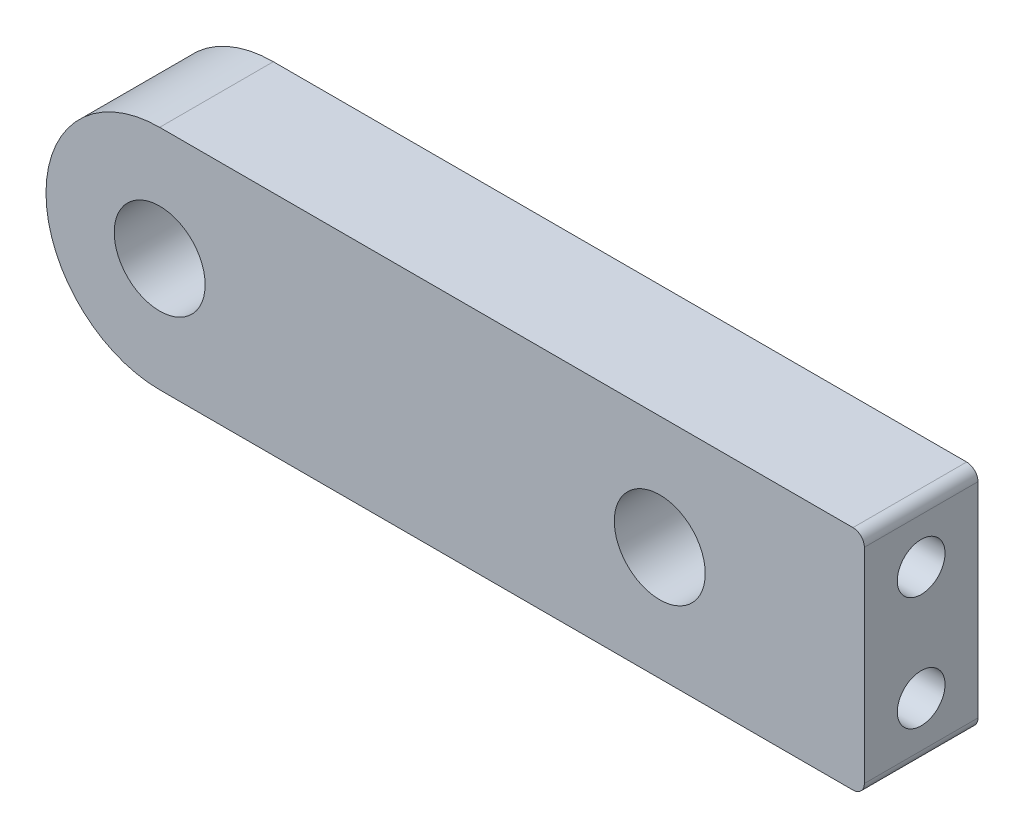
ISO-10303-21;
HEADER;
FILE_DESCRIPTION(('STEP AP214'),'2;1');
FILE_NAME('part.step','',(''),(''),'','','');
FILE_SCHEMA(('AUTOMOTIVE_DESIGN { 1 0 10303 214 1 1 1 1 }'));
ENDSEC;
DATA;
#1=APPLICATION_CONTEXT('core data for automotive mechanical design processes');
#2=APPLICATION_PROTOCOL_DEFINITION('international standard','automotive_design',2000,#1);
#3=PRODUCT_CONTEXT('',#1,'mechanical');
#4=PRODUCT('Part','Part','',(#3));
#5=PRODUCT_RELATED_PRODUCT_CATEGORY('part','',(#4));
#6=PRODUCT_DEFINITION_FORMATION('','',#4);
#7=PRODUCT_DEFINITION_CONTEXT('part definition',#1,'design');
#8=PRODUCT_DEFINITION('design','',#6,#7);
#9=PRODUCT_DEFINITION_SHAPE('','',#8);
#10=(LENGTH_UNIT() NAMED_UNIT(*) SI_UNIT(.MILLI.,.METRE.));
#11=(NAMED_UNIT(*) PLANE_ANGLE_UNIT() SI_UNIT($,.RADIAN.));
#12=(NAMED_UNIT(*) SI_UNIT($,.STERADIAN.) SOLID_ANGLE_UNIT());
#13=UNCERTAINTY_MEASURE_WITH_UNIT(LENGTH_MEASURE(1.E-05),#10,'distance_accuracy_value','');
#14=(GEOMETRIC_REPRESENTATION_CONTEXT(3) GLOBAL_UNCERTAINTY_ASSIGNED_CONTEXT((#13)) GLOBAL_UNIT_ASSIGNED_CONTEXT((#10,
#11,#12)) REPRESENTATION_CONTEXT('',''));
#15=CARTESIAN_POINT('',(0.,0.,0.));
#16=DIRECTION('',(0.,0.,1.));
#17=DIRECTION('',(1.,0.,0.));
#18=AXIS2_PLACEMENT_3D('',#15,#16,#17);
#19=CARTESIAN_POINT('',(72.,0.,10.));
#20=DIRECTION('',(1.,0.,0.));
#21=DIRECTION('',(0.,0.,-1.));
#22=AXIS2_PLACEMENT_3D('',#19,#20,#21);
#23=PLANE('',#22);
#24=CARTESIAN_POINT('',(72.,15.,5.));
#25=DIRECTION('',(1.,0.,0.));
#26=DIRECTION('',(0.,0.,-1.));
#27=AXIS2_PLACEMENT_3D('',#24,#25,#26);
#28=CIRCLE('',#27,2.09999999999999);
#29=CARTESIAN_POINT('',(72.,15.,2.90000000000001));
#30=VERTEX_POINT('',#29);
#31=EDGE_CURVE('E270',#30,#30,#28,.T.);
#32=ORIENTED_EDGE('',*,*,#31,.F.);
#33=EDGE_LOOP('',(#32));
#34=FACE_BOUND('',#33,.T.);
#35=CARTESIAN_POINT('',(72.,4.99999999999999,5.));
#36=DIRECTION('',(1.,0.,0.));
#37=DIRECTION('',(0.,0.,-1.));
#38=AXIS2_PLACEMENT_3D('',#35,#36,#37);
#39=CIRCLE('',#38,2.09999999999999);
#40=CARTESIAN_POINT('',(72.,4.99999999999999,2.90000000000001));
#41=VERTEX_POINT('',#40);
#42=EDGE_CURVE('E260',#41,#41,#39,.T.);
#43=ORIENTED_EDGE('',*,*,#42,.F.);
#44=EDGE_LOOP('',(#43));
#45=FACE_BOUND('',#44,.T.);
#46=DIRECTION('',(0.,-1.,0.));
#47=VECTOR('',#46,1.);
#48=CARTESIAN_POINT('',(72.,0.,10.));
#49=LINE('',#48,#47);
#50=CARTESIAN_POINT('',(72.,19.,10.));
#51=VERTEX_POINT('',#50);
#52=CARTESIAN_POINT('',(72.,1.,10.));
#53=VERTEX_POINT('',#52);
#54=EDGE_CURVE('E181',#51,#53,#49,.T.);
#55=ORIENTED_EDGE('',*,*,#54,.T.);
#56=DIRECTION('',(0.,0.,-1.));
#57=VECTOR('',#56,1.);
#58=CARTESIAN_POINT('',(72.,1.,0.));
#59=LINE('',#58,#57);
#60=CARTESIAN_POINT('',(72.,1.,0.));
#61=VERTEX_POINT('',#60);
#62=EDGE_CURVE('E164',#53,#61,#59,.T.);
#63=ORIENTED_EDGE('',*,*,#62,.T.);
#64=DIRECTION('',(0.,-1.,0.));
#65=VECTOR('',#64,1.);
#66=CARTESIAN_POINT('',(72.,0.,0.));
#67=LINE('',#66,#65);
#68=CARTESIAN_POINT('',(72.,19.,0.));
#69=VERTEX_POINT('',#68);
#70=EDGE_CURVE('E143',#69,#61,#67,.T.);
#71=ORIENTED_EDGE('',*,*,#70,.F.);
#72=DIRECTION('',(0.,0.,-1.));
#73=VECTOR('',#72,1.);
#74=CARTESIAN_POINT('',(72.,19.,10.));
#75=LINE('',#74,#73);
#76=EDGE_CURVE('E157',#69,#51,#75,.F.);
#77=ORIENTED_EDGE('',*,*,#76,.T.);
#78=EDGE_LOOP('',(#55,#63,#71,#77));
#79=FACE_BOUND('',#78,.T.);
#80=ADVANCED_FACE('F46',(#34,#45,#79),#23,.T.);
#81=CARTESIAN_POINT('',(0.,20.,10.));
#82=DIRECTION('',(0.,1.,0.));
#83=DIRECTION('',(0.,0.,1.));
#84=AXIS2_PLACEMENT_3D('',#81,#82,#83);
#85=PLANE('',#84);
#86=DIRECTION('',(1.,0.,0.));
#87=VECTOR('',#86,1.);
#88=CARTESIAN_POINT('',(0.,20.,10.));
#89=LINE('',#88,#87);
#90=CARTESIAN_POINT('',(10.,20.,10.));
#91=VERTEX_POINT('',#90);
#92=CARTESIAN_POINT('',(71.,20.,10.));
#93=VERTEX_POINT('',#92);
#94=EDGE_CURVE('E188',#91,#93,#89,.T.);
#95=ORIENTED_EDGE('',*,*,#94,.T.);
#96=DIRECTION('',(0.,0.,-1.));
#97=VECTOR('',#96,1.);
#98=CARTESIAN_POINT('',(71.,20.,10.));
#99=LINE('',#98,#97);
#100=CARTESIAN_POINT('',(71.,20.,0.));
#101=VERTEX_POINT('',#100);
#102=EDGE_CURVE('E11',#93,#101,#99,.T.);
#103=ORIENTED_EDGE('',*,*,#102,.T.);
#104=DIRECTION('',(1.,0.,0.));
#105=VECTOR('',#104,1.);
#106=CARTESIAN_POINT('',(0.,20.,0.));
#107=LINE('',#106,#105);
#108=CARTESIAN_POINT('',(10.,20.,0.));
#109=VERTEX_POINT('',#108);
#110=EDGE_CURVE('E134',#109,#101,#107,.T.);
#111=ORIENTED_EDGE('',*,*,#110,.F.);
#112=DIRECTION('',(0.,0.,-1.));
#113=VECTOR('',#112,1.);
#114=CARTESIAN_POINT('',(10.,20.,10.));
#115=LINE('',#114,#113);
#116=EDGE_CURVE('E154',#109,#91,#115,.F.);
#117=ORIENTED_EDGE('',*,*,#116,.T.);
#118=EDGE_LOOP('',(#95,#103,#111,#117));
#119=FACE_BOUND('',#118,.T.);
#120=ADVANCED_FACE('F203',(#119),#85,.T.);
#121=CARTESIAN_POINT('',(10.,10.,10.));
#122=DIRECTION('',(0.,0.,-1.));
#123=DIRECTION('',(-1.,0.,0.));
#124=AXIS2_PLACEMENT_3D('',#121,#122,#123);
#125=CYLINDRICAL_SURFACE('',#124,4.);
#126=CARTESIAN_POINT('',(10.,10.,10.));
#127=DIRECTION('',(0.,0.,1.));
#128=DIRECTION('',(1.,0.,0.));
#129=AXIS2_PLACEMENT_3D('',#126,#127,#128);
#130=CIRCLE('',#129,4.);
#131=CARTESIAN_POINT('',(14.,10.,10.));
#132=VERTEX_POINT('',#131);
#133=EDGE_CURVE('E140',#132,#132,#130,.T.);
#134=ORIENTED_EDGE('',*,*,#133,.T.);
#135=EDGE_LOOP('',(#134));
#136=FACE_BOUND('',#135,.T.);
#137=CARTESIAN_POINT('',(10.,10.,0.));
#138=DIRECTION('',(0.,0.,1.));
#139=DIRECTION('',(1.,0.,0.));
#140=AXIS2_PLACEMENT_3D('',#137,#138,#139);
#141=CIRCLE('',#140,4.);
#142=CARTESIAN_POINT('',(14.,10.,0.));
#143=VERTEX_POINT('',#142);
#144=EDGE_CURVE('E246',#143,#143,#141,.T.);
#145=ORIENTED_EDGE('',*,*,#144,.F.);
#146=EDGE_LOOP('',(#145));
#147=FACE_BOUND('',#146,.T.);
#148=ADVANCED_FACE('F209',(#136,#147),#125,.F.);
#149=CARTESIAN_POINT('',(54.,10.,10.));
#150=DIRECTION('',(0.,0.,-1.));
#151=DIRECTION('',(-1.,0.,0.));
#152=AXIS2_PLACEMENT_3D('',#149,#150,#151);
#153=CYLINDRICAL_SURFACE('',#152,4.00000000000001);
#154=CARTESIAN_POINT('',(54.,10.,10.));
#155=DIRECTION('',(0.,0.,1.));
#156=DIRECTION('',(1.,0.,0.));
#157=AXIS2_PLACEMENT_3D('',#154,#155,#156);
#158=CIRCLE('',#157,4.00000000000001);
#159=CARTESIAN_POINT('',(58.,10.,10.));
#160=VERTEX_POINT('',#159);
#161=EDGE_CURVE('E133',#160,#160,#158,.T.);
#162=ORIENTED_EDGE('',*,*,#161,.T.);
#163=EDGE_LOOP('',(#162));
#164=FACE_BOUND('',#163,.T.);
#165=CARTESIAN_POINT('',(54.,10.,0.));
#166=DIRECTION('',(0.,0.,1.));
#167=DIRECTION('',(1.,0.,0.));
#168=AXIS2_PLACEMENT_3D('',#165,#166,#167);
#169=CIRCLE('',#168,4.00000000000001);
#170=CARTESIAN_POINT('',(58.,10.,0.));
#171=VERTEX_POINT('',#170);
#172=EDGE_CURVE('E160',#171,#171,#169,.T.);
#173=ORIENTED_EDGE('',*,*,#172,.F.);
#174=EDGE_LOOP('',(#173));
#175=FACE_BOUND('',#174,.T.);
#176=ADVANCED_FACE('F218',(#164,#175),#153,.F.);
#177=CARTESIAN_POINT('',(0.,0.,10.));
#178=DIRECTION('',(0.,1.,0.));
#179=DIRECTION('',(0.,0.,1.));
#180=AXIS2_PLACEMENT_3D('',#177,#178,#179);
#181=PLANE('',#180);
#182=DIRECTION('',(1.,0.,0.));
#183=VECTOR('',#182,1.);
#184=CARTESIAN_POINT('',(0.,0.,0.));
#185=LINE('',#184,#183);
#186=CARTESIAN_POINT('',(10.,0.,0.));
#187=VERTEX_POINT('',#186);
#188=CARTESIAN_POINT('',(71.,0.,0.));
#189=VERTEX_POINT('',#188);
#190=EDGE_CURVE('E125',#187,#189,#185,.T.);
#191=ORIENTED_EDGE('',*,*,#190,.T.);
#192=DIRECTION('',(0.,0.,-1.));
#193=VECTOR('',#192,1.);
#194=CARTESIAN_POINT('',(71.,0.,10.));
#195=LINE('',#194,#193);
#196=CARTESIAN_POINT('',(71.,0.,10.));
#197=VERTEX_POINT('',#196);
#198=EDGE_CURVE('E70',#189,#197,#195,.F.);
#199=ORIENTED_EDGE('',*,*,#198,.T.);
#200=DIRECTION('',(1.,0.,0.));
#201=VECTOR('',#200,1.);
#202=CARTESIAN_POINT('',(0.,0.,10.));
#203=LINE('',#202,#201);
#204=CARTESIAN_POINT('',(10.,0.,10.));
#205=VERTEX_POINT('',#204);
#206=EDGE_CURVE('E126',#205,#197,#203,.T.);
#207=ORIENTED_EDGE('',*,*,#206,.F.);
#208=DIRECTION('',(0.,0.,-1.));
#209=VECTOR('',#208,1.);
#210=CARTESIAN_POINT('',(10.,0.,10.));
#211=LINE('',#210,#209);
#212=EDGE_CURVE('E114',#205,#187,#211,.T.);
#213=ORIENTED_EDGE('',*,*,#212,.T.);
#214=EDGE_LOOP('',(#191,#199,#207,#213));
#215=FACE_BOUND('',#214,.T.);
#216=ADVANCED_FACE('F124',(#215),#181,.F.);
#217=CARTESIAN_POINT('',(0.,0.,10.));
#218=DIRECTION('',(0.,0.,1.));
#219=DIRECTION('',(1.,0.,0.));
#220=AXIS2_PLACEMENT_3D('',#217,#218,#219);
#221=PLANE('',#220);
#222=ORIENTED_EDGE('',*,*,#161,.F.);
#223=EDGE_LOOP('',(#222));
#224=FACE_BOUND('',#223,.T.);
#225=ORIENTED_EDGE('',*,*,#133,.F.);
#226=EDGE_LOOP('',(#225));
#227=FACE_BOUND('',#226,.T.);
#228=ORIENTED_EDGE('',*,*,#206,.T.);
#229=CARTESIAN_POINT('',(71.,1.,10.));
#230=DIRECTION('',(0.,0.,1.));
#231=DIRECTION('',(1.,0.,0.));
#232=AXIS2_PLACEMENT_3D('',#229,#230,#231);
#233=CIRCLE('',#232,1.);
#234=EDGE_CURVE('E55',#197,#53,#233,.T.);
#235=ORIENTED_EDGE('',*,*,#234,.T.);
#236=ORIENTED_EDGE('',*,*,#54,.F.);
#237=CARTESIAN_POINT('',(71.,19.,10.));
#238=DIRECTION('',(0.,0.,1.));
#239=DIRECTION('',(1.,0.,0.));
#240=AXIS2_PLACEMENT_3D('',#237,#238,#239);
#241=CIRCLE('',#240,1.);
#242=EDGE_CURVE('E62',#51,#93,#241,.T.);
#243=ORIENTED_EDGE('',*,*,#242,.T.);
#244=ORIENTED_EDGE('',*,*,#94,.F.);
#245=CARTESIAN_POINT('',(10.,10.,10.));
#246=DIRECTION('',(0.,0.,1.));
#247=DIRECTION('',(1.,0.,0.));
#248=AXIS2_PLACEMENT_3D('',#245,#246,#247);
#249=CIRCLE('',#248,10.);
#250=CARTESIAN_POINT('',(0.,10.,10.));
#251=VERTEX_POINT('',#250);
#252=EDGE_CURVE('E121',#91,#251,#249,.T.);
#253=ORIENTED_EDGE('',*,*,#252,.T.);
#254=CARTESIAN_POINT('',(10.,10.,10.));
#255=DIRECTION('',(0.,0.,1.));
#256=DIRECTION('',(1.,0.,0.));
#257=AXIS2_PLACEMENT_3D('',#254,#255,#256);
#258=CIRCLE('',#257,10.);
#259=EDGE_CURVE('E151',#251,#205,#258,.T.);
#260=ORIENTED_EDGE('',*,*,#259,.T.);
#261=EDGE_LOOP('',(#228,#235,#236,#243,#244,#253,#260));
#262=FACE_BOUND('',#261,.T.);
#263=ADVANCED_FACE('F180',(#224,#227,#262),#221,.T.);
#264=CARTESIAN_POINT('',(0.,0.,0.));
#265=DIRECTION('',(0.,0.,1.));
#266=DIRECTION('',(1.,0.,0.));
#267=AXIS2_PLACEMENT_3D('',#264,#265,#266);
#268=PLANE('',#267);
#269=ORIENTED_EDGE('',*,*,#172,.T.);
#270=EDGE_LOOP('',(#269));
#271=FACE_BOUND('',#270,.T.);
#272=ORIENTED_EDGE('',*,*,#144,.T.);
#273=EDGE_LOOP('',(#272));
#274=FACE_BOUND('',#273,.T.);
#275=ORIENTED_EDGE('',*,*,#70,.T.);
#276=CARTESIAN_POINT('',(71.,1.,0.));
#277=DIRECTION('',(0.,0.,1.));
#278=DIRECTION('',(1.,0.,0.));
#279=AXIS2_PLACEMENT_3D('',#276,#277,#278);
#280=CIRCLE('',#279,1.);
#281=EDGE_CURVE('E131',#61,#189,#280,.F.);
#282=ORIENTED_EDGE('',*,*,#281,.T.);
#283=ORIENTED_EDGE('',*,*,#190,.F.);
#284=CARTESIAN_POINT('',(10.,10.,0.));
#285=DIRECTION('',(0.,0.,1.));
#286=DIRECTION('',(1.,0.,0.));
#287=AXIS2_PLACEMENT_3D('',#284,#285,#286);
#288=CIRCLE('',#287,10.);
#289=CARTESIAN_POINT('',(0.,10.,0.));
#290=VERTEX_POINT('',#289);
#291=EDGE_CURVE('E110',#187,#290,#288,.F.);
#292=ORIENTED_EDGE('',*,*,#291,.T.);
#293=CARTESIAN_POINT('',(10.,10.,0.));
#294=DIRECTION('',(0.,0.,1.));
#295=DIRECTION('',(1.,0.,0.));
#296=AXIS2_PLACEMENT_3D('',#293,#294,#295);
#297=CIRCLE('',#296,10.);
#298=EDGE_CURVE('E122',#290,#109,#297,.F.);
#299=ORIENTED_EDGE('',*,*,#298,.T.);
#300=ORIENTED_EDGE('',*,*,#110,.T.);
#301=CARTESIAN_POINT('',(71.,19.,0.));
#302=DIRECTION('',(0.,0.,1.));
#303=DIRECTION('',(1.,0.,0.));
#304=AXIS2_PLACEMENT_3D('',#301,#302,#303);
#305=CIRCLE('',#304,1.);
#306=EDGE_CURVE('E168',#101,#69,#305,.F.);
#307=ORIENTED_EDGE('',*,*,#306,.T.);
#308=EDGE_LOOP('',(#275,#282,#283,#292,#299,#300,#307));
#309=FACE_BOUND('',#308,.T.);
#310=ADVANCED_FACE('F130',(#271,#274,#309),#268,.F.);
#311=CARTESIAN_POINT('',(10.,10.,10.));
#312=DIRECTION('',(0.,0.,1.));
#313=DIRECTION('',(1.,0.,0.));
#314=AXIS2_PLACEMENT_3D('',#311,#312,#313);
#315=CYLINDRICAL_SURFACE('',#314,10.);
#316=DIRECTION('',(0.,0.,-1.));
#317=VECTOR('',#316,1.);
#318=CARTESIAN_POINT('',(0.,10.,0.));
#319=LINE('',#318,#317);
#320=EDGE_CURVE('E116',#251,#290,#319,.T.);
#321=ORIENTED_EDGE('',*,*,#320,.F.);
#322=ORIENTED_EDGE('',*,*,#252,.F.);
#323=ORIENTED_EDGE('',*,*,#116,.F.);
#324=ORIENTED_EDGE('',*,*,#298,.F.);
#325=EDGE_LOOP('',(#321,#322,#323,#324));
#326=FACE_BOUND('',#325,.T.);
#327=ADVANCED_FACE('F225',(#326),#315,.T.);
#328=CARTESIAN_POINT('',(10.,10.,10.));
#329=DIRECTION('',(0.,0.,-1.));
#330=DIRECTION('',(-1.,0.,0.));
#331=AXIS2_PLACEMENT_3D('',#328,#329,#330);
#332=CYLINDRICAL_SURFACE('',#331,10.);
#333=ORIENTED_EDGE('',*,*,#259,.F.);
#334=ORIENTED_EDGE('',*,*,#320,.T.);
#335=ORIENTED_EDGE('',*,*,#291,.F.);
#336=ORIENTED_EDGE('',*,*,#212,.F.);
#337=EDGE_LOOP('',(#333,#334,#335,#336));
#338=FACE_BOUND('',#337,.T.);
#339=ADVANCED_FACE('F113',(#338),#332,.T.);
#340=CARTESIAN_POINT('',(58.,4.99999999999998,5.));
#341=DIRECTION('',(-1.,0.,0.));
#342=DIRECTION('',(0.,0.,1.));
#343=AXIS2_PLACEMENT_3D('',#340,#341,#342);
#344=PLANE('',#343);
#345=CARTESIAN_POINT('',(58.,4.99999999999999,5.));
#346=DIRECTION('',(1.,0.,0.));
#347=DIRECTION('',(0.,0.,-1.));
#348=AXIS2_PLACEMENT_3D('',#345,#346,#347);
#349=CIRCLE('',#348,2.09999999999999);
#350=CARTESIAN_POINT('',(58.,4.99999999999999,2.90000000000001));
#351=VERTEX_POINT('',#350);
#352=EDGE_CURVE('E161',#351,#351,#349,.T.);
#353=ORIENTED_EDGE('',*,*,#352,.T.);
#354=EDGE_LOOP('',(#353));
#355=FACE_BOUND('',#354,.T.);
#356=ADVANCED_FACE('F224',(#355),#344,.F.);
#357=CARTESIAN_POINT('',(72.,4.99999999999999,5.));
#358=DIRECTION('',(1.,0.,0.));
#359=DIRECTION('',(0.,0.,-1.));
#360=AXIS2_PLACEMENT_3D('',#357,#358,#359);
#361=CYLINDRICAL_SURFACE('',#360,2.09999999999999);
#362=ORIENTED_EDGE('',*,*,#352,.F.);
#363=EDGE_LOOP('',(#362));
#364=FACE_BOUND('',#363,.T.);
#365=ORIENTED_EDGE('',*,*,#42,.T.);
#366=EDGE_LOOP('',(#365));
#367=FACE_BOUND('',#366,.T.);
#368=ADVANCED_FACE('F292',(#364,#367),#361,.F.);
#369=CARTESIAN_POINT('',(58.,15.,5.));
#370=DIRECTION('',(-1.,0.,0.));
#371=DIRECTION('',(0.,0.,1.));
#372=AXIS2_PLACEMENT_3D('',#369,#370,#371);
#373=PLANE('',#372);
#374=CARTESIAN_POINT('',(58.,15.,5.));
#375=DIRECTION('',(1.,0.,0.));
#376=DIRECTION('',(0.,0.,-1.));
#377=AXIS2_PLACEMENT_3D('',#374,#375,#376);
#378=CIRCLE('',#377,2.09999999999999);
#379=CARTESIAN_POINT('',(58.,15.,2.90000000000001));
#380=VERTEX_POINT('',#379);
#381=EDGE_CURVE('E265',#380,#380,#378,.T.);
#382=ORIENTED_EDGE('',*,*,#381,.T.);
#383=EDGE_LOOP('',(#382));
#384=FACE_BOUND('',#383,.T.);
#385=ADVANCED_FACE('F198',(#384),#373,.F.);
#386=CARTESIAN_POINT('',(72.,15.,5.));
#387=DIRECTION('',(1.,0.,0.));
#388=DIRECTION('',(0.,0.,-1.));
#389=AXIS2_PLACEMENT_3D('',#386,#387,#388);
#390=CYLINDRICAL_SURFACE('',#389,2.09999999999999);
#391=ORIENTED_EDGE('',*,*,#381,.F.);
#392=EDGE_LOOP('',(#391));
#393=FACE_BOUND('',#392,.T.);
#394=ORIENTED_EDGE('',*,*,#31,.T.);
#395=EDGE_LOOP('',(#394));
#396=FACE_BOUND('',#395,.T.);
#397=ADVANCED_FACE('F192',(#393,#396),#390,.F.);
#398=CARTESIAN_POINT('',(71.,1.,10.));
#399=DIRECTION('',(0.,0.,1.));
#400=DIRECTION('',(1.,0.,0.));
#401=AXIS2_PLACEMENT_3D('',#398,#399,#400);
#402=CYLINDRICAL_SURFACE('',#401,1.);
#403=ORIENTED_EDGE('',*,*,#234,.F.);
#404=ORIENTED_EDGE('',*,*,#198,.F.);
#405=ORIENTED_EDGE('',*,*,#281,.F.);
#406=ORIENTED_EDGE('',*,*,#62,.F.);
#407=EDGE_LOOP('',(#403,#404,#405,#406));
#408=FACE_BOUND('',#407,.T.);
#409=ADVANCED_FACE('F190',(#408),#402,.T.);
#410=CARTESIAN_POINT('',(71.,19.,10.));
#411=DIRECTION('',(0.,0.,-1.));
#412=DIRECTION('',(-1.,0.,0.));
#413=AXIS2_PLACEMENT_3D('',#410,#411,#412);
#414=CYLINDRICAL_SURFACE('',#413,1.);
#415=ORIENTED_EDGE('',*,*,#242,.F.);
#416=ORIENTED_EDGE('',*,*,#76,.F.);
#417=ORIENTED_EDGE('',*,*,#306,.F.);
#418=ORIENTED_EDGE('',*,*,#102,.F.);
#419=EDGE_LOOP('',(#415,#416,#417,#418));
#420=FACE_BOUND('',#419,.T.);
#421=ADVANCED_FACE('F48',(#420),#414,.T.);
#422=CLOSED_SHELL('',(#80,#120,#148,#176,#216,#263,#310,#327,#339,#356,#368,#385,#397,#409,#421));
#423=MANIFOLD_SOLID_BREP('B2',#422);
#424=ADVANCED_BREP_SHAPE_REPRESENTATION('',(#18,#423),#14);
#425=SHAPE_DEFINITION_REPRESENTATION(#9,#424);
ENDSEC;
END-ISO-10303-21;
